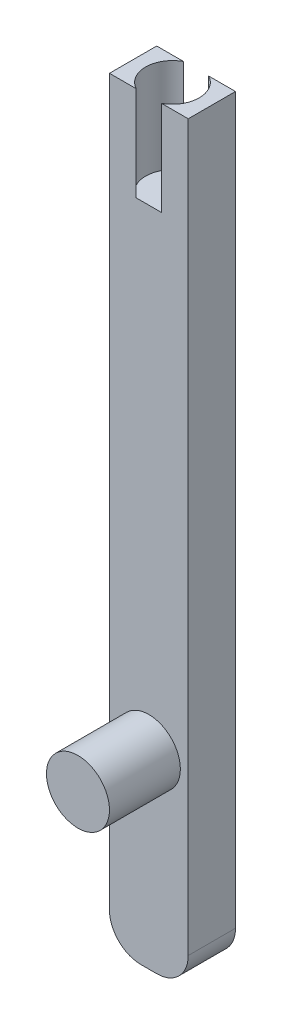
ISO-10303-21;
HEADER;
FILE_DESCRIPTION(('STEP AP214'),'2;1');
FILE_NAME('part.step','',(''),(''),'','','');
FILE_SCHEMA(('AUTOMOTIVE_DESIGN { 1 0 10303 214 1 1 1 1 }'));
ENDSEC;
DATA;
#1=APPLICATION_CONTEXT('core data for automotive mechanical design processes');
#2=APPLICATION_PROTOCOL_DEFINITION('international standard','automotive_design',2000,#1);
#3=PRODUCT_CONTEXT('',#1,'mechanical');
#4=PRODUCT('Part','Part','',(#3));
#5=PRODUCT_RELATED_PRODUCT_CATEGORY('part','',(#4));
#6=PRODUCT_DEFINITION_FORMATION('','',#4);
#7=PRODUCT_DEFINITION_CONTEXT('part definition',#1,'design');
#8=PRODUCT_DEFINITION('design','',#6,#7);
#9=PRODUCT_DEFINITION_SHAPE('','',#8);
#10=(LENGTH_UNIT() NAMED_UNIT(*) SI_UNIT(.MILLI.,.METRE.));
#11=(NAMED_UNIT(*) PLANE_ANGLE_UNIT() SI_UNIT($,.RADIAN.));
#12=(NAMED_UNIT(*) SI_UNIT($,.STERADIAN.) SOLID_ANGLE_UNIT());
#13=UNCERTAINTY_MEASURE_WITH_UNIT(LENGTH_MEASURE(1.E-05),#10,'distance_accuracy_value','');
#14=(GEOMETRIC_REPRESENTATION_CONTEXT(3) GLOBAL_UNCERTAINTY_ASSIGNED_CONTEXT((#13)) GLOBAL_UNIT_ASSIGNED_CONTEXT((#10,
#11,#12)) REPRESENTATION_CONTEXT('',''));
#15=CARTESIAN_POINT('',(0.,0.,0.));
#16=DIRECTION('',(0.,0.,1.));
#17=DIRECTION('',(1.,0.,0.));
#18=AXIS2_PLACEMENT_3D('',#15,#16,#17);
#19=CARTESIAN_POINT('',(0.,24.,1.5));
#20=DIRECTION('',(0.,-1.,0.));
#21=DIRECTION('',(0.,0.,-1.));
#22=AXIS2_PLACEMENT_3D('',#19,#20,#21);
#23=PLANE('',#22);
#24=DIRECTION('',(-1.,0.,0.));
#25=VECTOR('',#24,1.);
#26=CARTESIAN_POINT('',(0.,24.,0.));
#27=LINE('',#26,#25);
#28=CARTESIAN_POINT('',(0.,24.,0.));
#29=VERTEX_POINT('',#28);
#30=CARTESIAN_POINT('',(-0.85,24.,0.));
#31=VERTEX_POINT('',#30);
#32=EDGE_CURVE('E149',#29,#31,#27,.T.);
#33=ORIENTED_EDGE('',*,*,#32,.T.);
#34=CARTESIAN_POINT('',(-1.25,24.,0.75));
#35=DIRECTION('',(0.,1.,0.));
#36=DIRECTION('',(0.,0.,1.));
#37=AXIS2_PLACEMENT_3D('',#34,#35,#36);
#38=CIRCLE('',#37,0.85);
#39=CARTESIAN_POINT('',(-0.85,24.,1.5));
#40=VERTEX_POINT('',#39);
#41=EDGE_CURVE('E183',#40,#31,#38,.T.);
#42=ORIENTED_EDGE('',*,*,#41,.F.);
#43=DIRECTION('',(-1.,0.,0.));
#44=VECTOR('',#43,1.);
#45=CARTESIAN_POINT('',(0.,24.,1.5));
#46=LINE('',#45,#44);
#47=CARTESIAN_POINT('',(0.,24.,1.5));
#48=VERTEX_POINT('',#47);
#49=EDGE_CURVE('E133',#48,#40,#46,.T.);
#50=ORIENTED_EDGE('',*,*,#49,.F.);
#51=DIRECTION('',(0.,0.,-1.));
#52=VECTOR('',#51,1.);
#53=CARTESIAN_POINT('',(0.,24.,1.5));
#54=LINE('',#53,#52);
#55=EDGE_CURVE('E127',#48,#29,#54,.T.);
#56=ORIENTED_EDGE('',*,*,#55,.T.);
#57=EDGE_LOOP('',(#33,#42,#50,#56));
#58=FACE_BOUND('',#57,.T.);
#59=ADVANCED_FACE('F34',(#58),#23,.F.);
#60=CARTESIAN_POINT('',(-2.5,1.00000000000001,1.5));
#61=DIRECTION('',(1.,0.,0.));
#62=DIRECTION('',(0.,0.,-1.));
#63=AXIS2_PLACEMENT_3D('',#60,#61,#62);
#64=PLANE('',#63);
#65=DIRECTION('',(0.,-1.,0.));
#66=VECTOR('',#65,1.);
#67=CARTESIAN_POINT('',(-2.5,1.00000000000001,0.));
#68=LINE('',#67,#66);
#69=CARTESIAN_POINT('',(-2.5,24.,0.));
#70=VERTEX_POINT('',#69);
#71=CARTESIAN_POINT('',(-2.5,1.,0.));
#72=VERTEX_POINT('',#71);
#73=EDGE_CURVE('E138',#70,#72,#68,.T.);
#74=ORIENTED_EDGE('',*,*,#73,.T.);
#75=DIRECTION('',(0.,0.,-1.));
#76=VECTOR('',#75,1.);
#77=CARTESIAN_POINT('',(-2.5,1.,1.5));
#78=LINE('',#77,#76);
#79=CARTESIAN_POINT('',(-2.5,1.,1.5));
#80=VERTEX_POINT('',#79);
#81=EDGE_CURVE('E159',#80,#72,#78,.T.);
#82=ORIENTED_EDGE('',*,*,#81,.F.);
#83=DIRECTION('',(0.,-1.,0.));
#84=VECTOR('',#83,1.);
#85=CARTESIAN_POINT('',(-2.5,1.00000000000001,1.5));
#86=LINE('',#85,#84);
#87=CARTESIAN_POINT('',(-2.5,24.,1.5));
#88=VERTEX_POINT('',#87);
#89=EDGE_CURVE('E152',#88,#80,#86,.T.);
#90=ORIENTED_EDGE('',*,*,#89,.F.);
#91=DIRECTION('',(0.,0.,-1.));
#92=VECTOR('',#91,1.);
#93=CARTESIAN_POINT('',(-2.5,24.,1.5));
#94=LINE('',#93,#92);
#95=EDGE_CURVE('E137',#88,#70,#94,.T.);
#96=ORIENTED_EDGE('',*,*,#95,.T.);
#97=EDGE_LOOP('',(#74,#82,#90,#96));
#98=FACE_BOUND('',#97,.T.);
#99=ADVANCED_FACE('F36',(#98),#64,.F.);
#100=CARTESIAN_POINT('',(-1.5,1.,1.5));
#101=DIRECTION('',(0.,0.,-1.));
#102=DIRECTION('',(-1.,0.,0.));
#103=AXIS2_PLACEMENT_3D('',#100,#101,#102);
#104=CYLINDRICAL_SURFACE('',#103,1.);
#105=CARTESIAN_POINT('',(-1.5,1.,0.));
#106=DIRECTION('',(0.,0.,1.));
#107=DIRECTION('',(-1.,0.,0.));
#108=AXIS2_PLACEMENT_3D('',#105,#106,#107);
#109=CIRCLE('',#108,1.);
#110=CARTESIAN_POINT('',(-1.49999999999999,0.,0.));
#111=VERTEX_POINT('',#110);
#112=EDGE_CURVE('E141',#72,#111,#109,.T.);
#113=ORIENTED_EDGE('',*,*,#112,.T.);
#114=DIRECTION('',(0.,0.,-1.));
#115=VECTOR('',#114,1.);
#116=CARTESIAN_POINT('',(-1.49999999999999,0.,1.5));
#117=LINE('',#116,#115);
#118=CARTESIAN_POINT('',(-1.49999999999999,0.,1.5));
#119=VERTEX_POINT('',#118);
#120=EDGE_CURVE('E156',#119,#111,#117,.T.);
#121=ORIENTED_EDGE('',*,*,#120,.F.);
#122=CARTESIAN_POINT('',(-1.5,1.,1.5));
#123=DIRECTION('',(0.,0.,1.));
#124=DIRECTION('',(-1.,0.,0.));
#125=AXIS2_PLACEMENT_3D('',#122,#123,#124);
#126=CIRCLE('',#125,1.);
#127=EDGE_CURVE('E95',#80,#119,#126,.T.);
#128=ORIENTED_EDGE('',*,*,#127,.F.);
#129=ORIENTED_EDGE('',*,*,#81,.T.);
#130=EDGE_LOOP('',(#113,#121,#128,#129));
#131=FACE_BOUND('',#130,.T.);
#132=ADVANCED_FACE('F204',(#131),#104,.T.);
#133=CARTESIAN_POINT('',(-1.00000000000001,0.,1.5));
#134=DIRECTION('',(0.,1.,0.));
#135=DIRECTION('',(-1.,0.,0.));
#136=AXIS2_PLACEMENT_3D('',#133,#134,#135);
#137=PLANE('',#136);
#138=DIRECTION('',(1.,0.,0.));
#139=VECTOR('',#138,1.);
#140=CARTESIAN_POINT('',(-1.00000000000001,0.,0.));
#141=LINE('',#140,#139);
#142=CARTESIAN_POINT('',(-1.00000000000001,0.,0.));
#143=VERTEX_POINT('',#142);
#144=EDGE_CURVE('E144',#111,#143,#141,.T.);
#145=ORIENTED_EDGE('',*,*,#144,.T.);
#146=DIRECTION('',(0.,0.,-1.));
#147=VECTOR('',#146,1.);
#148=CARTESIAN_POINT('',(-1.00000000000001,0.,1.5));
#149=LINE('',#148,#147);
#150=CARTESIAN_POINT('',(-1.00000000000001,0.,1.5));
#151=VERTEX_POINT('',#150);
#152=EDGE_CURVE('E126',#151,#143,#149,.T.);
#153=ORIENTED_EDGE('',*,*,#152,.F.);
#154=DIRECTION('',(1.,0.,0.));
#155=VECTOR('',#154,1.);
#156=CARTESIAN_POINT('',(-1.00000000000001,0.,1.5));
#157=LINE('',#156,#155);
#158=EDGE_CURVE('E114',#119,#151,#157,.T.);
#159=ORIENTED_EDGE('',*,*,#158,.F.);
#160=ORIENTED_EDGE('',*,*,#120,.T.);
#161=EDGE_LOOP('',(#145,#153,#159,#160));
#162=FACE_BOUND('',#161,.T.);
#163=ADVANCED_FACE('F207',(#162),#137,.F.);
#164=CARTESIAN_POINT('',(-1.,1.,1.5));
#165=DIRECTION('',(0.,0.,-1.));
#166=DIRECTION('',(-1.,0.,0.));
#167=AXIS2_PLACEMENT_3D('',#164,#165,#166);
#168=CYLINDRICAL_SURFACE('',#167,1.);
#169=CARTESIAN_POINT('',(-1.,1.,0.));
#170=DIRECTION('',(0.,0.,1.));
#171=DIRECTION('',(1.,0.,0.));
#172=AXIS2_PLACEMENT_3D('',#169,#170,#171);
#173=CIRCLE('',#172,1.);
#174=CARTESIAN_POINT('',(0.,1.00000000000001,0.));
#175=VERTEX_POINT('',#174);
#176=EDGE_CURVE('E123',#143,#175,#173,.T.);
#177=ORIENTED_EDGE('',*,*,#176,.T.);
#178=DIRECTION('',(0.,0.,-1.));
#179=VECTOR('',#178,1.);
#180=CARTESIAN_POINT('',(0.,1.00000000000001,1.5));
#181=LINE('',#180,#179);
#182=CARTESIAN_POINT('',(0.,1.00000000000001,1.5));
#183=VERTEX_POINT('',#182);
#184=EDGE_CURVE('E120',#183,#175,#181,.T.);
#185=ORIENTED_EDGE('',*,*,#184,.F.);
#186=CARTESIAN_POINT('',(-1.,1.,1.5));
#187=DIRECTION('',(0.,0.,1.));
#188=DIRECTION('',(1.,0.,0.));
#189=AXIS2_PLACEMENT_3D('',#186,#187,#188);
#190=CIRCLE('',#189,1.);
#191=EDGE_CURVE('E104',#151,#183,#190,.T.);
#192=ORIENTED_EDGE('',*,*,#191,.F.);
#193=ORIENTED_EDGE('',*,*,#152,.T.);
#194=EDGE_LOOP('',(#177,#185,#192,#193));
#195=FACE_BOUND('',#194,.T.);
#196=ADVANCED_FACE('F121',(#195),#168,.T.);
#197=CARTESIAN_POINT('',(0.,1.00000000000001,1.5));
#198=DIRECTION('',(-1.,0.,0.));
#199=DIRECTION('',(0.,-1.,0.));
#200=AXIS2_PLACEMENT_3D('',#197,#198,#199);
#201=PLANE('',#200);
#202=DIRECTION('',(0.,1.,0.));
#203=VECTOR('',#202,1.);
#204=CARTESIAN_POINT('',(0.,1.00000000000001,0.));
#205=LINE('',#204,#203);
#206=EDGE_CURVE('E147',#175,#29,#205,.T.);
#207=ORIENTED_EDGE('',*,*,#206,.T.);
#208=ORIENTED_EDGE('',*,*,#55,.F.);
#209=DIRECTION('',(0.,1.,0.));
#210=VECTOR('',#209,1.);
#211=CARTESIAN_POINT('',(0.,1.00000000000001,1.5));
#212=LINE('',#211,#210);
#213=EDGE_CURVE('E111',#183,#48,#212,.T.);
#214=ORIENTED_EDGE('',*,*,#213,.F.);
#215=ORIENTED_EDGE('',*,*,#184,.T.);
#216=EDGE_LOOP('',(#207,#208,#214,#215));
#217=FACE_BOUND('',#216,.T.);
#218=ADVANCED_FACE('F129',(#217),#201,.F.);
#219=CARTESIAN_POINT('',(-1.65,24.,1.5));
#220=VERTEX_POINT('',#219);
#221=EDGE_CURVE('E58',#220,#88,#46,.T.);
#222=ORIENTED_EDGE('',*,*,#221,.F.);
#223=CARTESIAN_POINT('',(-1.65,24.,0.));
#224=VERTEX_POINT('',#223);
#225=EDGE_CURVE('E177',#224,#220,#38,.T.);
#226=ORIENTED_EDGE('',*,*,#225,.F.);
#227=EDGE_CURVE('E86',#224,#70,#27,.T.);
#228=ORIENTED_EDGE('',*,*,#227,.T.);
#229=ORIENTED_EDGE('',*,*,#95,.F.);
#230=EDGE_LOOP('',(#222,#226,#228,#229));
#231=FACE_BOUND('',#230,.T.);
#232=ADVANCED_FACE('F182',(#231),#23,.F.);
#233=CARTESIAN_POINT('',(-1.,1.,1.5));
#234=DIRECTION('',(0.,0.,1.));
#235=DIRECTION('',(1.,0.,0.));
#236=AXIS2_PLACEMENT_3D('',#233,#234,#235);
#237=PLANE('',#236);
#238=DIRECTION('',(0.,1.,0.));
#239=VECTOR('',#238,1.);
#240=CARTESIAN_POINT('',(-0.85,21.,1.5));
#241=LINE('',#240,#239);
#242=CARTESIAN_POINT('',(-0.85,21.,1.5));
#243=VERTEX_POINT('',#242);
#244=EDGE_CURVE('E193',#243,#40,#241,.T.);
#245=ORIENTED_EDGE('',*,*,#244,.F.);
#246=DIRECTION('',(-1.,0.,0.));
#247=VECTOR('',#246,1.);
#248=CARTESIAN_POINT('',(-1.,21.,1.5));
#249=LINE('',#248,#247);
#250=CARTESIAN_POINT('',(-1.65,21.,1.5));
#251=VERTEX_POINT('',#250);
#252=EDGE_CURVE('E188',#243,#251,#249,.T.);
#253=ORIENTED_EDGE('',*,*,#252,.T.);
#254=DIRECTION('',(0.,1.,0.));
#255=VECTOR('',#254,1.);
#256=CARTESIAN_POINT('',(-1.65,21.,1.5));
#257=LINE('',#256,#255);
#258=EDGE_CURVE('E191',#220,#251,#257,.F.);
#259=ORIENTED_EDGE('',*,*,#258,.F.);
#260=ORIENTED_EDGE('',*,*,#221,.T.);
#261=ORIENTED_EDGE('',*,*,#89,.T.);
#262=ORIENTED_EDGE('',*,*,#127,.T.);
#263=ORIENTED_EDGE('',*,*,#158,.T.);
#264=ORIENTED_EDGE('',*,*,#191,.T.);
#265=ORIENTED_EDGE('',*,*,#213,.T.);
#266=ORIENTED_EDGE('',*,*,#49,.T.);
#267=EDGE_LOOP('',(#245,#253,#259,#260,#261,#262,#263,#264,#265,#266));
#268=FACE_BOUND('',#267,.T.);
#269=CARTESIAN_POINT('',(-1.25,6.,1.5));
#270=DIRECTION('',(0.,0.,1.));
#271=DIRECTION('',(1.,0.,0.));
#272=AXIS2_PLACEMENT_3D('',#269,#270,#271);
#273=CIRCLE('',#272,1.);
#274=CARTESIAN_POINT('',(-0.249999999999997,6.,1.5));
#275=VERTEX_POINT('',#274);
#276=EDGE_CURVE('E196',#275,#275,#273,.T.);
#277=ORIENTED_EDGE('',*,*,#276,.F.);
#278=EDGE_LOOP('',(#277));
#279=FACE_BOUND('',#278,.T.);
#280=ADVANCED_FACE('F107',(#268,#279),#237,.T.);
#281=CARTESIAN_POINT('',(-1.,1.,0.));
#282=DIRECTION('',(0.,0.,1.));
#283=DIRECTION('',(1.,0.,0.));
#284=AXIS2_PLACEMENT_3D('',#281,#282,#283);
#285=PLANE('',#284);
#286=DIRECTION('',(-1.,0.,0.));
#287=VECTOR('',#286,1.);
#288=CARTESIAN_POINT('',(-1.,21.,0.));
#289=LINE('',#288,#287);
#290=CARTESIAN_POINT('',(-0.85,21.,0.));
#291=VERTEX_POINT('',#290);
#292=CARTESIAN_POINT('',(-1.65,21.,0.));
#293=VERTEX_POINT('',#292);
#294=EDGE_CURVE('E161',#291,#293,#289,.T.);
#295=ORIENTED_EDGE('',*,*,#294,.F.);
#296=DIRECTION('',(0.,1.,0.));
#297=VECTOR('',#296,1.);
#298=CARTESIAN_POINT('',(-0.85,21.,0.));
#299=LINE('',#298,#297);
#300=EDGE_CURVE('E11',#291,#31,#299,.T.);
#301=ORIENTED_EDGE('',*,*,#300,.T.);
#302=ORIENTED_EDGE('',*,*,#32,.F.);
#303=ORIENTED_EDGE('',*,*,#206,.F.);
#304=ORIENTED_EDGE('',*,*,#176,.F.);
#305=ORIENTED_EDGE('',*,*,#144,.F.);
#306=ORIENTED_EDGE('',*,*,#112,.F.);
#307=ORIENTED_EDGE('',*,*,#73,.F.);
#308=ORIENTED_EDGE('',*,*,#227,.F.);
#309=DIRECTION('',(0.,1.,0.));
#310=VECTOR('',#309,1.);
#311=CARTESIAN_POINT('',(-1.65,21.,0.));
#312=LINE('',#311,#310);
#313=EDGE_CURVE('E42',#224,#293,#312,.F.);
#314=ORIENTED_EDGE('',*,*,#313,.T.);
#315=EDGE_LOOP('',(#295,#301,#302,#303,#304,#305,#306,#307,#308,#314));
#316=FACE_BOUND('',#315,.T.);
#317=ADVANCED_FACE('F167',(#316),#285,.F.);
#318=CARTESIAN_POINT('',(-1.25,6.,3.75));
#319=DIRECTION('',(0.,0.,-1.));
#320=DIRECTION('',(-1.,0.,0.));
#321=AXIS2_PLACEMENT_3D('',#318,#319,#320);
#322=CYLINDRICAL_SURFACE('',#321,1.);
#323=CARTESIAN_POINT('',(-1.25,6.,3.75));
#324=DIRECTION('',(0.,0.,1.));
#325=DIRECTION('',(1.,0.,0.));
#326=AXIS2_PLACEMENT_3D('',#323,#324,#325);
#327=CIRCLE('',#326,1.);
#328=CARTESIAN_POINT('',(-0.249999999999997,6.,3.75));
#329=VERTEX_POINT('',#328);
#330=EDGE_CURVE('E142',#329,#329,#327,.T.);
#331=ORIENTED_EDGE('',*,*,#330,.F.);
#332=EDGE_LOOP('',(#331));
#333=FACE_BOUND('',#332,.T.);
#334=ORIENTED_EDGE('',*,*,#276,.T.);
#335=EDGE_LOOP('',(#334));
#336=FACE_BOUND('',#335,.T.);
#337=ADVANCED_FACE('F226',(#333,#336),#322,.T.);
#338=CARTESIAN_POINT('',(-1.25,6.,3.75));
#339=DIRECTION('',(0.,0.,1.));
#340=DIRECTION('',(1.,0.,0.));
#341=AXIS2_PLACEMENT_3D('',#338,#339,#340);
#342=PLANE('',#341);
#343=ORIENTED_EDGE('',*,*,#330,.T.);
#344=EDGE_LOOP('',(#343));
#345=FACE_BOUND('',#344,.T.);
#346=ADVANCED_FACE('F220',(#345),#342,.T.);
#347=CARTESIAN_POINT('',(-1.25,21.,0.75));
#348=DIRECTION('',(0.,1.,0.));
#349=DIRECTION('',(0.,0.,1.));
#350=AXIS2_PLACEMENT_3D('',#347,#348,#349);
#351=CYLINDRICAL_SURFACE('',#350,0.85);
#352=ORIENTED_EDGE('',*,*,#244,.T.);
#353=ORIENTED_EDGE('',*,*,#41,.T.);
#354=ORIENTED_EDGE('',*,*,#300,.F.);
#355=CARTESIAN_POINT('',(-1.25,21.,0.75));
#356=DIRECTION('',(0.,1.,0.));
#357=DIRECTION('',(0.,0.,1.));
#358=AXIS2_PLACEMENT_3D('',#355,#356,#357);
#359=CIRCLE('',#358,0.85);
#360=EDGE_CURVE('E49',#243,#291,#359,.T.);
#361=ORIENTED_EDGE('',*,*,#360,.F.);
#362=EDGE_LOOP('',(#352,#353,#354,#361));
#363=FACE_BOUND('',#362,.T.);
#364=ADVANCED_FACE('F218',(#363),#351,.F.);
#365=ORIENTED_EDGE('',*,*,#258,.T.);
#366=EDGE_CURVE('E179',#293,#251,#359,.T.);
#367=ORIENTED_EDGE('',*,*,#366,.F.);
#368=ORIENTED_EDGE('',*,*,#313,.F.);
#369=ORIENTED_EDGE('',*,*,#225,.T.);
#370=EDGE_LOOP('',(#365,#367,#368,#369));
#371=FACE_BOUND('',#370,.T.);
#372=ADVANCED_FACE('F175',(#371),#351,.F.);
#373=CARTESIAN_POINT('',(-1.25,21.,0.75));
#374=DIRECTION('',(0.,1.,0.));
#375=DIRECTION('',(0.,0.,1.));
#376=AXIS2_PLACEMENT_3D('',#373,#374,#375);
#377=PLANE('',#376);
#378=ORIENTED_EDGE('',*,*,#360,.T.);
#379=ORIENTED_EDGE('',*,*,#294,.T.);
#380=ORIENTED_EDGE('',*,*,#366,.T.);
#381=ORIENTED_EDGE('',*,*,#252,.F.);
#382=EDGE_LOOP('',(#378,#379,#380,#381));
#383=FACE_BOUND('',#382,.T.);
#384=ADVANCED_FACE('F217',(#383),#377,.T.);
#385=CLOSED_SHELL('',(#59,#99,#132,#163,#196,#218,#232,#280,#317,#337,#346,#364,#372,#384));
#386=MANIFOLD_SOLID_BREP('B2',#385);
#387=ADVANCED_BREP_SHAPE_REPRESENTATION('',(#18,#386),#14);
#388=SHAPE_DEFINITION_REPRESENTATION(#9,#387);
ENDSEC;
END-ISO-10303-21;
